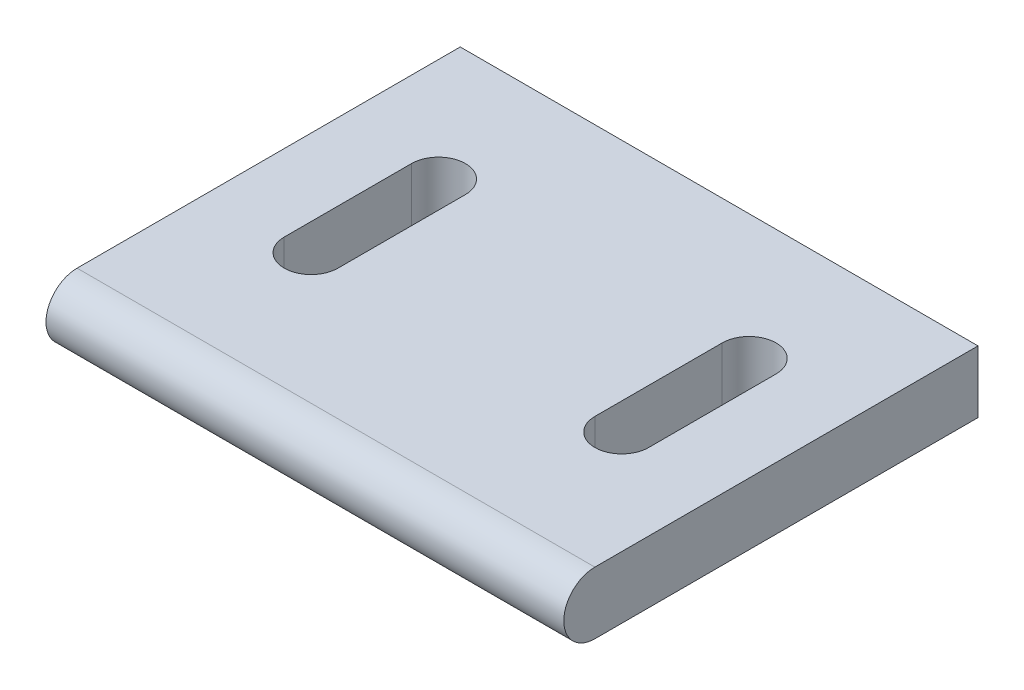
ISO-10303-21;
HEADER;
FILE_DESCRIPTION(('STEP AP214'),'2;1');
FILE_NAME('part.step','',(''),(''),'','','');
FILE_SCHEMA(('AUTOMOTIVE_DESIGN { 1 0 10303 214 1 1 1 1 }'));
ENDSEC;
DATA;
#1=APPLICATION_CONTEXT('core data for automotive mechanical design processes');
#2=APPLICATION_PROTOCOL_DEFINITION('international standard','automotive_design',2000,#1);
#3=PRODUCT_CONTEXT('',#1,'mechanical');
#4=PRODUCT('Part','Part','',(#3));
#5=PRODUCT_RELATED_PRODUCT_CATEGORY('part','',(#4));
#6=PRODUCT_DEFINITION_FORMATION('','',#4);
#7=PRODUCT_DEFINITION_CONTEXT('part definition',#1,'design');
#8=PRODUCT_DEFINITION('design','',#6,#7);
#9=PRODUCT_DEFINITION_SHAPE('','',#8);
#10=(LENGTH_UNIT() NAMED_UNIT(*) SI_UNIT(.MILLI.,.METRE.));
#11=(NAMED_UNIT(*) PLANE_ANGLE_UNIT() SI_UNIT($,.RADIAN.));
#12=(NAMED_UNIT(*) SI_UNIT($,.STERADIAN.) SOLID_ANGLE_UNIT());
#13=UNCERTAINTY_MEASURE_WITH_UNIT(LENGTH_MEASURE(1.E-05),#10,'distance_accuracy_value','');
#14=(GEOMETRIC_REPRESENTATION_CONTEXT(3) GLOBAL_UNCERTAINTY_ASSIGNED_CONTEXT((#13)) GLOBAL_UNIT_ASSIGNED_CONTEXT((#10,
#11,#12)) REPRESENTATION_CONTEXT('',''));
#15=CARTESIAN_POINT('',(0.,0.,0.));
#16=DIRECTION('',(0.,0.,1.));
#17=DIRECTION('',(1.,0.,0.));
#18=AXIS2_PLACEMENT_3D('',#15,#16,#17);
#19=CARTESIAN_POINT('',(0.,6.,0.));
#20=DIRECTION('',(0.,1.,0.));
#21=DIRECTION('',(0.,0.,1.));
#22=AXIS2_PLACEMENT_3D('',#19,#20,#21);
#23=PLANE('',#22);
#24=CARTESIAN_POINT('',(40.,6.,24.4));
#25=DIRECTION('',(0.,1.,0.));
#26=DIRECTION('',(0.,0.,1.));
#27=AXIS2_PLACEMENT_3D('',#24,#25,#26);
#28=CIRCLE('',#27,2.6);
#29=CARTESIAN_POINT('',(42.6,6.,24.4));
#30=VERTEX_POINT('',#29);
#31=CARTESIAN_POINT('',(37.4,6.,24.4));
#32=VERTEX_POINT('',#31);
#33=EDGE_CURVE('E197',#30,#32,#28,.F.);
#34=ORIENTED_EDGE('',*,*,#33,.T.);
#35=DIRECTION('',(0.,0.,1.));
#36=VECTOR('',#35,1.);
#37=CARTESIAN_POINT('',(37.4,6.,12.1));
#38=LINE('',#37,#36);
#39=CARTESIAN_POINT('',(37.4,6.,12.1));
#40=VERTEX_POINT('',#39);
#41=EDGE_CURVE('E167',#32,#40,#38,.F.);
#42=ORIENTED_EDGE('',*,*,#41,.T.);
#43=CARTESIAN_POINT('',(40.,6.,12.1));
#44=DIRECTION('',(0.,1.,0.));
#45=DIRECTION('',(0.,0.,1.));
#46=AXIS2_PLACEMENT_3D('',#43,#44,#45);
#47=CIRCLE('',#46,2.6);
#48=CARTESIAN_POINT('',(42.6,6.,12.1));
#49=VERTEX_POINT('',#48);
#50=EDGE_CURVE('E175',#40,#49,#47,.F.);
#51=ORIENTED_EDGE('',*,*,#50,.T.);
#52=DIRECTION('',(0.,0.,-1.));
#53=VECTOR('',#52,1.);
#54=CARTESIAN_POINT('',(42.6,6.,24.4));
#55=LINE('',#54,#53);
#56=EDGE_CURVE('E122',#49,#30,#55,.F.);
#57=ORIENTED_EDGE('',*,*,#56,.T.);
#58=EDGE_LOOP('',(#34,#42,#51,#57));
#59=FACE_BOUND('',#58,.T.);
#60=CARTESIAN_POINT('',(10.,6.,24.4));
#61=DIRECTION('',(0.,1.,0.));
#62=DIRECTION('',(0.,0.,1.));
#63=AXIS2_PLACEMENT_3D('',#60,#61,#62);
#64=CIRCLE('',#63,2.6);
#65=CARTESIAN_POINT('',(12.6,6.,24.4));
#66=VERTEX_POINT('',#65);
#67=CARTESIAN_POINT('',(7.4,6.,24.4));
#68=VERTEX_POINT('',#67);
#69=EDGE_CURVE('E201',#66,#68,#64,.F.);
#70=ORIENTED_EDGE('',*,*,#69,.T.);
#71=DIRECTION('',(0.,0.,1.));
#72=VECTOR('',#71,1.);
#73=CARTESIAN_POINT('',(7.4,6.,12.1));
#74=LINE('',#73,#72);
#75=CARTESIAN_POINT('',(7.4,6.,12.1));
#76=VERTEX_POINT('',#75);
#77=EDGE_CURVE('E177',#68,#76,#74,.F.);
#78=ORIENTED_EDGE('',*,*,#77,.T.);
#79=CARTESIAN_POINT('',(10.,6.,12.1));
#80=DIRECTION('',(0.,1.,0.));
#81=DIRECTION('',(0.,0.,1.));
#82=AXIS2_PLACEMENT_3D('',#79,#80,#81);
#83=CIRCLE('',#82,2.6);
#84=CARTESIAN_POINT('',(12.6,6.,12.1));
#85=VERTEX_POINT('',#84);
#86=EDGE_CURVE('E183',#76,#85,#83,.F.);
#87=ORIENTED_EDGE('',*,*,#86,.T.);
#88=DIRECTION('',(0.,0.,-1.));
#89=VECTOR('',#88,1.);
#90=CARTESIAN_POINT('',(12.6,6.,24.4));
#91=LINE('',#90,#89);
#92=EDGE_CURVE('E172',#85,#66,#91,.F.);
#93=ORIENTED_EDGE('',*,*,#92,.T.);
#94=EDGE_LOOP('',(#70,#78,#87,#93));
#95=FACE_BOUND('',#94,.T.);
#96=DIRECTION('',(0.,0.,-1.));
#97=VECTOR('',#96,1.);
#98=CARTESIAN_POINT('',(50.,6.,18.8821195863841));
#99=LINE('',#98,#97);
#100=CARTESIAN_POINT('',(50.,6.,0.));
#101=VERTEX_POINT('',#100);
#102=CARTESIAN_POINT('',(50.,6.,37.));
#103=VERTEX_POINT('',#102);
#104=EDGE_CURVE('E132',#101,#103,#99,.F.);
#105=ORIENTED_EDGE('',*,*,#104,.F.);
#106=DIRECTION('',(-1.,0.,0.));
#107=VECTOR('',#106,1.);
#108=CARTESIAN_POINT('',(0.,6.,0.));
#109=LINE('',#108,#107);
#110=CARTESIAN_POINT('',(0.,6.,0.));
#111=VERTEX_POINT('',#110);
#112=EDGE_CURVE('E103',#111,#101,#109,.F.);
#113=ORIENTED_EDGE('',*,*,#112,.F.);
#114=DIRECTION('',(0.,0.,-1.));
#115=VECTOR('',#114,1.);
#116=CARTESIAN_POINT('',(0.,6.,18.8821195863841));
#117=LINE('',#116,#115);
#118=CARTESIAN_POINT('',(0.,6.,37.));
#119=VERTEX_POINT('',#118);
#120=EDGE_CURVE('E95',#111,#119,#117,.F.);
#121=ORIENTED_EDGE('',*,*,#120,.T.);
#122=DIRECTION('',(1.,0.,0.));
#123=VECTOR('',#122,1.);
#124=CARTESIAN_POINT('',(0.,6.,37.));
#125=LINE('',#124,#123);
#126=EDGE_CURVE('E130',#103,#119,#125,.F.);
#127=ORIENTED_EDGE('',*,*,#126,.F.);
#128=EDGE_LOOP('',(#105,#113,#121,#127));
#129=FACE_BOUND('',#128,.T.);
#130=ADVANCED_FACE('F17',(#59,#95,#129),#23,.T.);
#131=CARTESIAN_POINT('',(0.,3.,18.8821195863841));
#132=DIRECTION('',(1.,0.,0.));
#133=DIRECTION('',(0.,0.,-1.));
#134=AXIS2_PLACEMENT_3D('',#131,#132,#133);
#135=PLANE('',#134);
#136=CARTESIAN_POINT('',(0.,3.,37.));
#137=DIRECTION('',(1.,0.,0.));
#138=DIRECTION('',(0.,0.,-1.));
#139=AXIS2_PLACEMENT_3D('',#136,#137,#138);
#140=CIRCLE('',#139,3.);
#141=CARTESIAN_POINT('',(0.,0.,37.));
#142=VERTEX_POINT('',#141);
#143=EDGE_CURVE('E20',#119,#142,#140,.T.);
#144=ORIENTED_EDGE('',*,*,#143,.F.);
#145=ORIENTED_EDGE('',*,*,#120,.F.);
#146=DIRECTION('',(0.,1.,0.));
#147=VECTOR('',#146,1.);
#148=CARTESIAN_POINT('',(0.,0.,0.));
#149=LINE('',#148,#147);
#150=CARTESIAN_POINT('',(0.,0.,0.));
#151=VERTEX_POINT('',#150);
#152=EDGE_CURVE('E111',#151,#111,#149,.T.);
#153=ORIENTED_EDGE('',*,*,#152,.F.);
#154=DIRECTION('',(0.,0.,-1.));
#155=VECTOR('',#154,1.);
#156=CARTESIAN_POINT('',(0.,0.,37.));
#157=LINE('',#156,#155);
#158=EDGE_CURVE('E114',#142,#151,#157,.T.);
#159=ORIENTED_EDGE('',*,*,#158,.F.);
#160=EDGE_LOOP('',(#144,#145,#153,#159));
#161=FACE_BOUND('',#160,.T.);
#162=ADVANCED_FACE('F116',(#161),#135,.F.);
#163=CARTESIAN_POINT('',(0.,0.,0.));
#164=DIRECTION('',(0.,0.,-1.));
#165=DIRECTION('',(-1.,0.,0.));
#166=AXIS2_PLACEMENT_3D('',#163,#164,#165);
#167=PLANE('',#166);
#168=DIRECTION('',(0.,1.,0.));
#169=VECTOR('',#168,1.);
#170=CARTESIAN_POINT('',(50.,3.,0.));
#171=LINE('',#170,#169);
#172=CARTESIAN_POINT('',(50.,0.,0.));
#173=VERTEX_POINT('',#172);
#174=EDGE_CURVE('E148',#173,#101,#171,.T.);
#175=ORIENTED_EDGE('',*,*,#174,.F.);
#176=DIRECTION('',(1.,0.,0.));
#177=VECTOR('',#176,1.);
#178=CARTESIAN_POINT('',(0.,0.,0.));
#179=LINE('',#178,#177);
#180=EDGE_CURVE('E121',#151,#173,#179,.T.);
#181=ORIENTED_EDGE('',*,*,#180,.F.);
#182=ORIENTED_EDGE('',*,*,#152,.T.);
#183=ORIENTED_EDGE('',*,*,#112,.T.);
#184=EDGE_LOOP('',(#175,#181,#182,#183));
#185=FACE_BOUND('',#184,.T.);
#186=ADVANCED_FACE('F213',(#185),#167,.T.);
#187=CARTESIAN_POINT('',(50.,3.,18.8821195863841));
#188=DIRECTION('',(1.,0.,0.));
#189=DIRECTION('',(0.,0.,-1.));
#190=AXIS2_PLACEMENT_3D('',#187,#188,#189);
#191=PLANE('',#190);
#192=ORIENTED_EDGE('',*,*,#104,.T.);
#193=CARTESIAN_POINT('',(50.,3.,37.));
#194=DIRECTION('',(1.,0.,0.));
#195=DIRECTION('',(0.,0.,-1.));
#196=AXIS2_PLACEMENT_3D('',#193,#194,#195);
#197=CIRCLE('',#196,3.);
#198=CARTESIAN_POINT('',(50.,0.,37.));
#199=VERTEX_POINT('',#198);
#200=EDGE_CURVE('E131',#199,#103,#197,.F.);
#201=ORIENTED_EDGE('',*,*,#200,.F.);
#202=DIRECTION('',(0.,0.,-1.));
#203=VECTOR('',#202,1.);
#204=CARTESIAN_POINT('',(50.,0.,37.));
#205=LINE('',#204,#203);
#206=EDGE_CURVE('E135',#173,#199,#205,.F.);
#207=ORIENTED_EDGE('',*,*,#206,.F.);
#208=ORIENTED_EDGE('',*,*,#174,.T.);
#209=EDGE_LOOP('',(#192,#201,#207,#208));
#210=FACE_BOUND('',#209,.T.);
#211=ADVANCED_FACE('F206',(#210),#191,.T.);
#212=CARTESIAN_POINT('',(0.,3.,37.));
#213=DIRECTION('',(1.,0.,0.));
#214=DIRECTION('',(0.,0.,-1.));
#215=AXIS2_PLACEMENT_3D('',#212,#213,#214);
#216=CYLINDRICAL_SURFACE('',#215,3.);
#217=ORIENTED_EDGE('',*,*,#200,.T.);
#218=ORIENTED_EDGE('',*,*,#126,.T.);
#219=ORIENTED_EDGE('',*,*,#143,.T.);
#220=DIRECTION('',(1.,0.,0.));
#221=VECTOR('',#220,1.);
#222=CARTESIAN_POINT('',(0.,0.,37.));
#223=LINE('',#222,#221);
#224=EDGE_CURVE('E128',#199,#142,#223,.F.);
#225=ORIENTED_EDGE('',*,*,#224,.F.);
#226=EDGE_LOOP('',(#217,#218,#219,#225));
#227=FACE_BOUND('',#226,.T.);
#228=ADVANCED_FACE('F127',(#227),#216,.T.);
#229=CARTESIAN_POINT('',(10.,0.,12.1));
#230=DIRECTION('',(0.,1.,0.));
#231=DIRECTION('',(0.,0.,1.));
#232=AXIS2_PLACEMENT_3D('',#229,#230,#231);
#233=CYLINDRICAL_SURFACE('',#232,2.6);
#234=DIRECTION('',(0.,1.,0.));
#235=VECTOR('',#234,1.);
#236=CARTESIAN_POINT('',(7.4,0.,12.1));
#237=LINE('',#236,#235);
#238=CARTESIAN_POINT('',(7.4,0.,12.1));
#239=VERTEX_POINT('',#238);
#240=EDGE_CURVE('E181',#76,#239,#237,.F.);
#241=ORIENTED_EDGE('',*,*,#240,.T.);
#242=CARTESIAN_POINT('',(10.,0.,12.1));
#243=DIRECTION('',(0.,1.,0.));
#244=DIRECTION('',(0.,0.,1.));
#245=AXIS2_PLACEMENT_3D('',#242,#243,#244);
#246=CIRCLE('',#245,2.6);
#247=CARTESIAN_POINT('',(12.6,0.,12.1));
#248=VERTEX_POINT('',#247);
#249=EDGE_CURVE('E136',#248,#239,#246,.T.);
#250=ORIENTED_EDGE('',*,*,#249,.F.);
#251=DIRECTION('',(0.,1.,0.));
#252=VECTOR('',#251,1.);
#253=CARTESIAN_POINT('',(12.6,0.,12.1));
#254=LINE('',#253,#252);
#255=EDGE_CURVE('E176',#248,#85,#254,.T.);
#256=ORIENTED_EDGE('',*,*,#255,.T.);
#257=ORIENTED_EDGE('',*,*,#86,.F.);
#258=EDGE_LOOP('',(#241,#250,#256,#257));
#259=FACE_BOUND('',#258,.T.);
#260=ADVANCED_FACE('F248',(#259),#233,.F.);
#261=CARTESIAN_POINT('',(7.4,0.,12.1));
#262=DIRECTION('',(-1.,0.,0.));
#263=DIRECTION('',(0.,0.,1.));
#264=AXIS2_PLACEMENT_3D('',#261,#262,#263);
#265=PLANE('',#264);
#266=DIRECTION('',(0.,1.,0.));
#267=VECTOR('',#266,1.);
#268=CARTESIAN_POINT('',(7.4,0.,24.4));
#269=LINE('',#268,#267);
#270=CARTESIAN_POINT('',(7.4,0.,24.4));
#271=VERTEX_POINT('',#270);
#272=EDGE_CURVE('E180',#68,#271,#269,.F.);
#273=ORIENTED_EDGE('',*,*,#272,.T.);
#274=DIRECTION('',(0.,0.,-1.));
#275=VECTOR('',#274,1.);
#276=CARTESIAN_POINT('',(7.4,0.,37.));
#277=LINE('',#276,#275);
#278=EDGE_CURVE('E139',#239,#271,#277,.F.);
#279=ORIENTED_EDGE('',*,*,#278,.F.);
#280=ORIENTED_EDGE('',*,*,#240,.F.);
#281=ORIENTED_EDGE('',*,*,#77,.F.);
#282=EDGE_LOOP('',(#273,#279,#280,#281));
#283=FACE_BOUND('',#282,.T.);
#284=ADVANCED_FACE('F244',(#283),#265,.F.);
#285=CARTESIAN_POINT('',(10.,0.,24.4));
#286=DIRECTION('',(0.,1.,0.));
#287=DIRECTION('',(0.,0.,1.));
#288=AXIS2_PLACEMENT_3D('',#285,#286,#287);
#289=CYLINDRICAL_SURFACE('',#288,2.6);
#290=DIRECTION('',(0.,1.,0.));
#291=VECTOR('',#290,1.);
#292=CARTESIAN_POINT('',(12.6,0.,24.4));
#293=LINE('',#292,#291);
#294=CARTESIAN_POINT('',(12.6,0.,24.4));
#295=VERTEX_POINT('',#294);
#296=EDGE_CURVE('E204',#66,#295,#293,.F.);
#297=ORIENTED_EDGE('',*,*,#296,.T.);
#298=CARTESIAN_POINT('',(10.,0.,24.4));
#299=DIRECTION('',(0.,1.,0.));
#300=DIRECTION('',(0.,0.,1.));
#301=AXIS2_PLACEMENT_3D('',#298,#299,#300);
#302=CIRCLE('',#301,2.6);
#303=EDGE_CURVE('E194',#271,#295,#302,.T.);
#304=ORIENTED_EDGE('',*,*,#303,.F.);
#305=ORIENTED_EDGE('',*,*,#272,.F.);
#306=ORIENTED_EDGE('',*,*,#69,.F.);
#307=EDGE_LOOP('',(#297,#304,#305,#306));
#308=FACE_BOUND('',#307,.T.);
#309=ADVANCED_FACE('F240',(#308),#289,.F.);
#310=CARTESIAN_POINT('',(12.6,0.,24.4));
#311=DIRECTION('',(1.,0.,0.));
#312=DIRECTION('',(0.,0.,-1.));
#313=AXIS2_PLACEMENT_3D('',#310,#311,#312);
#314=PLANE('',#313);
#315=ORIENTED_EDGE('',*,*,#255,.F.);
#316=DIRECTION('',(0.,0.,-1.));
#317=VECTOR('',#316,1.);
#318=CARTESIAN_POINT('',(12.6,0.,37.));
#319=LINE('',#318,#317);
#320=EDGE_CURVE('E193',#295,#248,#319,.T.);
#321=ORIENTED_EDGE('',*,*,#320,.F.);
#322=ORIENTED_EDGE('',*,*,#296,.F.);
#323=ORIENTED_EDGE('',*,*,#92,.F.);
#324=EDGE_LOOP('',(#315,#321,#322,#323));
#325=FACE_BOUND('',#324,.T.);
#326=ADVANCED_FACE('F236',(#325),#314,.F.);
#327=CARTESIAN_POINT('',(40.,0.,12.1));
#328=DIRECTION('',(0.,1.,0.));
#329=DIRECTION('',(0.,0.,1.));
#330=AXIS2_PLACEMENT_3D('',#327,#328,#329);
#331=CYLINDRICAL_SURFACE('',#330,2.6);
#332=DIRECTION('',(0.,1.,0.));
#333=VECTOR('',#332,1.);
#334=CARTESIAN_POINT('',(37.4,0.,12.1));
#335=LINE('',#334,#333);
#336=CARTESIAN_POINT('',(37.4,0.,12.1));
#337=VERTEX_POINT('',#336);
#338=EDGE_CURVE('E171',#40,#337,#335,.F.);
#339=ORIENTED_EDGE('',*,*,#338,.T.);
#340=CARTESIAN_POINT('',(40.,0.,12.1));
#341=DIRECTION('',(0.,1.,0.));
#342=DIRECTION('',(0.,0.,1.));
#343=AXIS2_PLACEMENT_3D('',#340,#341,#342);
#344=CIRCLE('',#343,2.6);
#345=CARTESIAN_POINT('',(42.6,0.,12.1));
#346=VERTEX_POINT('',#345);
#347=EDGE_CURVE('E190',#346,#337,#344,.T.);
#348=ORIENTED_EDGE('',*,*,#347,.F.);
#349=DIRECTION('',(0.,1.,0.));
#350=VECTOR('',#349,1.);
#351=CARTESIAN_POINT('',(42.6,0.,12.1));
#352=LINE('',#351,#350);
#353=EDGE_CURVE('E166',#346,#49,#352,.T.);
#354=ORIENTED_EDGE('',*,*,#353,.T.);
#355=ORIENTED_EDGE('',*,*,#50,.F.);
#356=EDGE_LOOP('',(#339,#348,#354,#355));
#357=FACE_BOUND('',#356,.T.);
#358=ADVANCED_FACE('F232',(#357),#331,.F.);
#359=CARTESIAN_POINT('',(37.4,0.,12.1));
#360=DIRECTION('',(-1.,0.,0.));
#361=DIRECTION('',(0.,0.,1.));
#362=AXIS2_PLACEMENT_3D('',#359,#360,#361);
#363=PLANE('',#362);
#364=DIRECTION('',(0.,1.,0.));
#365=VECTOR('',#364,1.);
#366=CARTESIAN_POINT('',(37.4,0.,24.4));
#367=LINE('',#366,#365);
#368=CARTESIAN_POINT('',(37.4,0.,24.4));
#369=VERTEX_POINT('',#368);
#370=EDGE_CURVE('E170',#32,#369,#367,.F.);
#371=ORIENTED_EDGE('',*,*,#370,.T.);
#372=DIRECTION('',(0.,0.,-1.));
#373=VECTOR('',#372,1.);
#374=CARTESIAN_POINT('',(37.4,0.,37.));
#375=LINE('',#374,#373);
#376=EDGE_CURVE('E189',#337,#369,#375,.F.);
#377=ORIENTED_EDGE('',*,*,#376,.F.);
#378=ORIENTED_EDGE('',*,*,#338,.F.);
#379=ORIENTED_EDGE('',*,*,#41,.F.);
#380=EDGE_LOOP('',(#371,#377,#378,#379));
#381=FACE_BOUND('',#380,.T.);
#382=ADVANCED_FACE('F229',(#381),#363,.F.);
#383=CARTESIAN_POINT('',(40.,0.,24.4));
#384=DIRECTION('',(0.,1.,0.));
#385=DIRECTION('',(0.,0.,1.));
#386=AXIS2_PLACEMENT_3D('',#383,#384,#385);
#387=CYLINDRICAL_SURFACE('',#386,2.6);
#388=DIRECTION('',(0.,1.,0.));
#389=VECTOR('',#388,1.);
#390=CARTESIAN_POINT('',(42.6,0.,24.4));
#391=LINE('',#390,#389);
#392=CARTESIAN_POINT('',(42.6,0.,24.4));
#393=VERTEX_POINT('',#392);
#394=EDGE_CURVE('E35',#30,#393,#391,.F.);
#395=ORIENTED_EDGE('',*,*,#394,.T.);
#396=CARTESIAN_POINT('',(40.,0.,24.4));
#397=DIRECTION('',(0.,1.,0.));
#398=DIRECTION('',(0.,0.,1.));
#399=AXIS2_PLACEMENT_3D('',#396,#397,#398);
#400=CIRCLE('',#399,2.6);
#401=EDGE_CURVE('E26',#369,#393,#400,.T.);
#402=ORIENTED_EDGE('',*,*,#401,.F.);
#403=ORIENTED_EDGE('',*,*,#370,.F.);
#404=ORIENTED_EDGE('',*,*,#33,.F.);
#405=EDGE_LOOP('',(#395,#402,#403,#404));
#406=FACE_BOUND('',#405,.T.);
#407=ADVANCED_FACE('F222',(#406),#387,.F.);
#408=CARTESIAN_POINT('',(42.6,0.,24.4));
#409=DIRECTION('',(1.,0.,0.));
#410=DIRECTION('',(0.,0.,-1.));
#411=AXIS2_PLACEMENT_3D('',#408,#409,#410);
#412=PLANE('',#411);
#413=ORIENTED_EDGE('',*,*,#353,.F.);
#414=DIRECTION('',(0.,0.,-1.));
#415=VECTOR('',#414,1.);
#416=CARTESIAN_POINT('',(42.6,0.,37.));
#417=LINE('',#416,#415);
#418=EDGE_CURVE('E11',#393,#346,#417,.T.);
#419=ORIENTED_EDGE('',*,*,#418,.F.);
#420=ORIENTED_EDGE('',*,*,#394,.F.);
#421=ORIENTED_EDGE('',*,*,#56,.F.);
#422=EDGE_LOOP('',(#413,#419,#420,#421));
#423=FACE_BOUND('',#422,.T.);
#424=ADVANCED_FACE('F216',(#423),#412,.F.);
#425=CARTESIAN_POINT('',(0.,0.,37.));
#426=DIRECTION('',(0.,-1.,0.));
#427=DIRECTION('',(0.,0.,-1.));
#428=AXIS2_PLACEMENT_3D('',#425,#426,#427);
#429=PLANE('',#428);
#430=ORIENTED_EDGE('',*,*,#401,.T.);
#431=ORIENTED_EDGE('',*,*,#418,.T.);
#432=ORIENTED_EDGE('',*,*,#347,.T.);
#433=ORIENTED_EDGE('',*,*,#376,.T.);
#434=EDGE_LOOP('',(#430,#431,#432,#433));
#435=FACE_BOUND('',#434,.T.);
#436=ORIENTED_EDGE('',*,*,#303,.T.);
#437=ORIENTED_EDGE('',*,*,#320,.T.);
#438=ORIENTED_EDGE('',*,*,#249,.T.);
#439=ORIENTED_EDGE('',*,*,#278,.T.);
#440=EDGE_LOOP('',(#436,#437,#438,#439));
#441=FACE_BOUND('',#440,.T.);
#442=ORIENTED_EDGE('',*,*,#206,.T.);
#443=ORIENTED_EDGE('',*,*,#224,.T.);
#444=ORIENTED_EDGE('',*,*,#158,.T.);
#445=ORIENTED_EDGE('',*,*,#180,.T.);
#446=EDGE_LOOP('',(#442,#443,#444,#445));
#447=FACE_BOUND('',#446,.T.);
#448=ADVANCED_FACE('F133',(#435,#441,#447),#429,.T.);
#449=CLOSED_SHELL('',(#130,#162,#186,#211,#228,#260,#284,#309,#326,#358,#382,#407,#424,#448));
#450=MANIFOLD_SOLID_BREP('B1',#449);
#451=ADVANCED_BREP_SHAPE_REPRESENTATION('',(#18,#450),#14);
#452=SHAPE_DEFINITION_REPRESENTATION(#9,#451);
ENDSEC;
END-ISO-10303-21;
